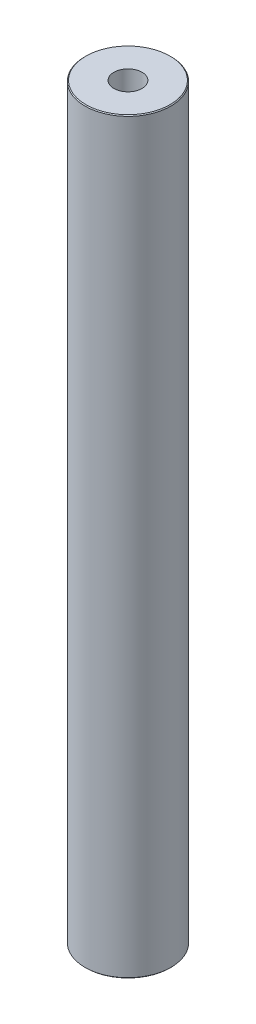
ISO-10303-21;
HEADER;
FILE_DESCRIPTION(('STEP AP214'),'2;1');
FILE_NAME('part.step','',(''),(''),'','','');
FILE_SCHEMA(('AUTOMOTIVE_DESIGN { 1 0 10303 214 1 1 1 1 }'));
ENDSEC;
DATA;
#1=APPLICATION_CONTEXT('core data for automotive mechanical design processes');
#2=APPLICATION_PROTOCOL_DEFINITION('international standard','automotive_design',2000,#1);
#3=PRODUCT_CONTEXT('',#1,'mechanical');
#4=PRODUCT('Part','Part','',(#3));
#5=PRODUCT_RELATED_PRODUCT_CATEGORY('part','',(#4));
#6=PRODUCT_DEFINITION_FORMATION('','',#4);
#7=PRODUCT_DEFINITION_CONTEXT('part definition',#1,'design');
#8=PRODUCT_DEFINITION('design','',#6,#7);
#9=PRODUCT_DEFINITION_SHAPE('','',#8);
#10=(LENGTH_UNIT() NAMED_UNIT(*) SI_UNIT(.MILLI.,.METRE.));
#11=(NAMED_UNIT(*) PLANE_ANGLE_UNIT() SI_UNIT($,.RADIAN.));
#12=(NAMED_UNIT(*) SI_UNIT($,.STERADIAN.) SOLID_ANGLE_UNIT());
#13=UNCERTAINTY_MEASURE_WITH_UNIT(LENGTH_MEASURE(1.E-05),#10,'distance_accuracy_value','');
#14=(GEOMETRIC_REPRESENTATION_CONTEXT(3) GLOBAL_UNCERTAINTY_ASSIGNED_CONTEXT((#13)) GLOBAL_UNIT_ASSIGNED_CONTEXT((#10,
#11,#12)) REPRESENTATION_CONTEXT('',''));
#15=CARTESIAN_POINT('',(0.,0.,0.));
#16=DIRECTION('',(0.,0.,1.));
#17=DIRECTION('',(1.,0.,0.));
#18=AXIS2_PLACEMENT_3D('',#15,#16,#17);
#19=CARTESIAN_POINT('',(0.,261.24426693429,0.));
#20=DIRECTION('',(0.,-1.,0.));
#21=DIRECTION('',(0.,0.,-1.));
#22=AXIS2_PLACEMENT_3D('',#19,#20,#21);
#23=CYLINDRICAL_SURFACE('',#22,15.);
#24=CARTESIAN_POINT('',(0.,260.947124538022,0.));
#25=DIRECTION('',(0.,1.,0.));
#26=DIRECTION('',(0.,0.,1.));
#27=AXIS2_PLACEMENT_3D('',#24,#25,#26);
#28=CIRCLE('',#27,15.);
#29=CARTESIAN_POINT('',(0.,260.947124538022,15.));
#30=VERTEX_POINT('',#29);
#31=EDGE_CURVE('E50',#30,#30,#28,.F.);
#32=ORIENTED_EDGE('',*,*,#31,.T.);
#33=EDGE_LOOP('',(#32));
#34=FACE_BOUND('',#33,.T.);
#35=CARTESIAN_POINT('',(0.,0.297142396267713,0.));
#36=DIRECTION('',(0.,1.,0.));
#37=DIRECTION('',(0.,0.,1.));
#38=AXIS2_PLACEMENT_3D('',#35,#36,#37);
#39=CIRCLE('',#38,15.);
#40=CARTESIAN_POINT('',(0.,0.297142396267713,15.));
#41=VERTEX_POINT('',#40);
#42=EDGE_CURVE('E51',#41,#41,#39,.T.);
#43=ORIENTED_EDGE('',*,*,#42,.T.);
#44=EDGE_LOOP('',(#43));
#45=FACE_BOUND('',#44,.T.);
#46=ADVANCED_FACE('F39',(#34,#45),#23,.T.);
#47=CARTESIAN_POINT('',(0.,261.24426693429,0.));
#48=DIRECTION('',(0.,1.,0.));
#49=DIRECTION('',(0.,0.,1.));
#50=AXIS2_PLACEMENT_3D('',#47,#48,#49);
#51=PLANE('',#50);
#52=CARTESIAN_POINT('',(0.,261.24426693429,0.));
#53=DIRECTION('',(0.,1.,0.));
#54=DIRECTION('',(0.,0.,1.));
#55=AXIS2_PLACEMENT_3D('',#52,#53,#54);
#56=CIRCLE('',#55,14.7028576037323);
#57=CARTESIAN_POINT('',(0.,261.24426693429,14.7028576037323));
#58=VERTEX_POINT('',#57);
#59=EDGE_CURVE('E54',#58,#58,#56,.T.);
#60=ORIENTED_EDGE('',*,*,#59,.T.);
#61=EDGE_LOOP('',(#60));
#62=FACE_BOUND('',#61,.T.);
#63=CARTESIAN_POINT('',(0.,261.24426693429,0.));
#64=DIRECTION('',(0.,1.,0.));
#65=DIRECTION('',(0.,0.,1.));
#66=AXIS2_PLACEMENT_3D('',#63,#64,#65);
#67=CIRCLE('',#66,4.92396146288954);
#68=CARTESIAN_POINT('',(0.,261.24426693429,4.92396146288954));
#69=VERTEX_POINT('',#68);
#70=EDGE_CURVE('E58',#69,#69,#67,.T.);
#71=ORIENTED_EDGE('',*,*,#70,.F.);
#72=EDGE_LOOP('',(#71));
#73=FACE_BOUND('',#72,.T.);
#74=ADVANCED_FACE('F69',(#62,#73),#51,.T.);
#75=CARTESIAN_POINT('',(0.,0.,0.));
#76=DIRECTION('',(0.,1.,0.));
#77=DIRECTION('',(0.,0.,1.));
#78=AXIS2_PLACEMENT_3D('',#75,#76,#77);
#79=PLANE('',#78);
#80=CARTESIAN_POINT('',(0.,0.,0.));
#81=DIRECTION('',(0.,1.,0.));
#82=DIRECTION('',(0.,0.,1.));
#83=AXIS2_PLACEMENT_3D('',#80,#81,#82);
#84=CIRCLE('',#83,14.7028576037323);
#85=CARTESIAN_POINT('',(0.,0.,14.7028576037323));
#86=VERTEX_POINT('',#85);
#87=EDGE_CURVE('E10',#86,#86,#84,.F.);
#88=ORIENTED_EDGE('',*,*,#87,.T.);
#89=EDGE_LOOP('',(#88));
#90=FACE_BOUND('',#89,.T.);
#91=CARTESIAN_POINT('',(0.,0.,0.));
#92=DIRECTION('',(0.,1.,0.));
#93=DIRECTION('',(0.,0.,1.));
#94=AXIS2_PLACEMENT_3D('',#91,#92,#93);
#95=CIRCLE('',#94,4.92396146288954);
#96=CARTESIAN_POINT('',(0.,0.,4.92396146288954));
#97=VERTEX_POINT('',#96);
#98=EDGE_CURVE('E63',#97,#97,#95,.T.);
#99=ORIENTED_EDGE('',*,*,#98,.T.);
#100=EDGE_LOOP('',(#99));
#101=FACE_BOUND('',#100,.T.);
#102=ADVANCED_FACE('F75',(#90,#101),#79,.F.);
#103=CARTESIAN_POINT('',(0.,261.24426693429,0.));
#104=DIRECTION('',(0.,-1.,0.));
#105=DIRECTION('',(0.,0.,-1.));
#106=AXIS2_PLACEMENT_3D('',#103,#104,#105);
#107=CYLINDRICAL_SURFACE('',#106,4.92396146288954);
#108=ORIENTED_EDGE('',*,*,#70,.T.);
#109=EDGE_LOOP('',(#108));
#110=FACE_BOUND('',#109,.T.);
#111=ORIENTED_EDGE('',*,*,#98,.F.);
#112=EDGE_LOOP('',(#111));
#113=FACE_BOUND('',#112,.T.);
#114=ADVANCED_FACE('F70',(#110,#113),#107,.F.);
#115=CARTESIAN_POINT('',(0.,261.24426693429,0.));
#116=DIRECTION('',(0.,-1.,0.));
#117=DIRECTION('',(0.,0.,-1.));
#118=AXIS2_PLACEMENT_3D('',#115,#116,#117);
#119=CONICAL_SURFACE('',#118,14.7028576037323,0.785398163397288);
#120=ORIENTED_EDGE('',*,*,#31,.F.);
#121=EDGE_LOOP('',(#120));
#122=FACE_BOUND('',#121,.T.);
#123=ORIENTED_EDGE('',*,*,#59,.F.);
#124=EDGE_LOOP('',(#123));
#125=FACE_BOUND('',#124,.T.);
#126=ADVANCED_FACE('F81',(#122,#125),#119,.T.);
#127=CARTESIAN_POINT('',(0.,0.297142396267713,0.));
#128=DIRECTION('',(0.,1.,0.));
#129=DIRECTION('',(0.,0.,1.));
#130=AXIS2_PLACEMENT_3D('',#127,#128,#129);
#131=CONICAL_SURFACE('',#130,15.,0.785398163397472);
#132=ORIENTED_EDGE('',*,*,#87,.F.);
#133=EDGE_LOOP('',(#132));
#134=FACE_BOUND('',#133,.T.);
#135=ORIENTED_EDGE('',*,*,#42,.F.);
#136=EDGE_LOOP('',(#135));
#137=FACE_BOUND('',#136,.T.);
#138=ADVANCED_FACE('F45',(#134,#137),#131,.T.);
#139=CLOSED_SHELL('',(#46,#74,#102,#114,#126,#138));
#140=MANIFOLD_SOLID_BREP('B2',#139);
#141=ADVANCED_BREP_SHAPE_REPRESENTATION('',(#18,#140),#14);
#142=SHAPE_DEFINITION_REPRESENTATION(#9,#141);
ENDSEC;
END-ISO-10303-21;
